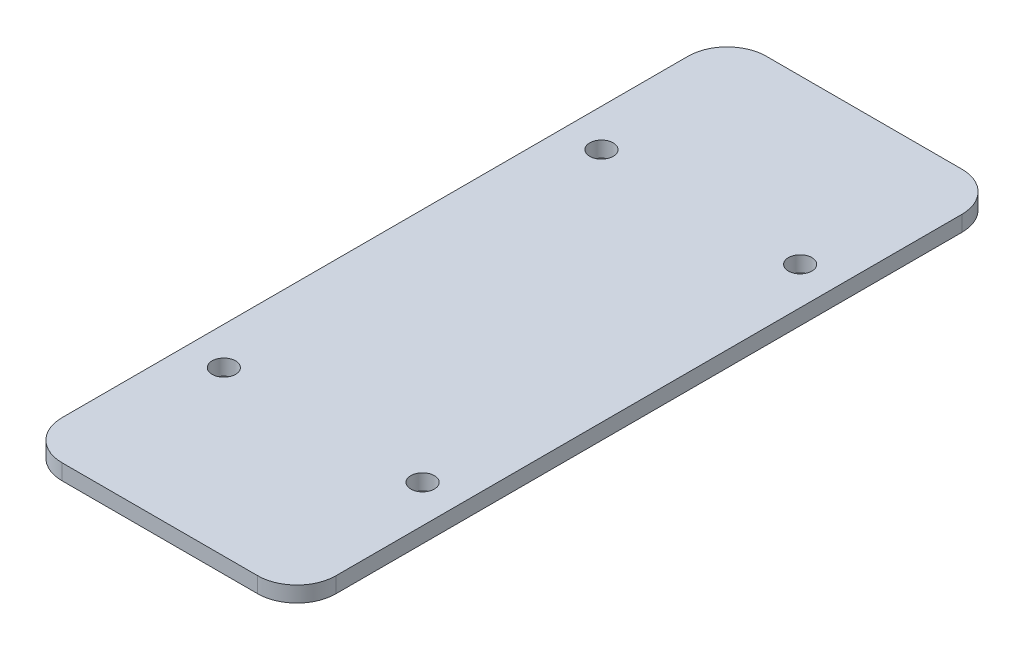
ISO-10303-21;
HEADER;
FILE_DESCRIPTION(('STEP AP214'),'2;1');
FILE_NAME('part.step','',(''),(''),'','','');
FILE_SCHEMA(('AUTOMOTIVE_DESIGN { 1 0 10303 214 1 1 1 1 }'));
ENDSEC;
DATA;
#1=APPLICATION_CONTEXT('core data for automotive mechanical design processes');
#2=APPLICATION_PROTOCOL_DEFINITION('international standard','automotive_design',2000,#1);
#3=PRODUCT_CONTEXT('',#1,'mechanical');
#4=PRODUCT('Part','Part','',(#3));
#5=PRODUCT_RELATED_PRODUCT_CATEGORY('part','',(#4));
#6=PRODUCT_DEFINITION_FORMATION('','',#4);
#7=PRODUCT_DEFINITION_CONTEXT('part definition',#1,'design');
#8=PRODUCT_DEFINITION('design','',#6,#7);
#9=PRODUCT_DEFINITION_SHAPE('','',#8);
#10=(LENGTH_UNIT() NAMED_UNIT(*) SI_UNIT(.MILLI.,.METRE.));
#11=(NAMED_UNIT(*) PLANE_ANGLE_UNIT() SI_UNIT($,.RADIAN.));
#12=(NAMED_UNIT(*) SI_UNIT($,.STERADIAN.) SOLID_ANGLE_UNIT());
#13=UNCERTAINTY_MEASURE_WITH_UNIT(LENGTH_MEASURE(1.E-05),#10,'distance_accuracy_value','');
#14=(GEOMETRIC_REPRESENTATION_CONTEXT(3) GLOBAL_UNCERTAINTY_ASSIGNED_CONTEXT((#13)) GLOBAL_UNIT_ASSIGNED_CONTEXT((#10,
#11,#12)) REPRESENTATION_CONTEXT('',''));
#15=CARTESIAN_POINT('',(0.,0.,0.));
#16=DIRECTION('',(0.,0.,1.));
#17=DIRECTION('',(1.,0.,0.));
#18=AXIS2_PLACEMENT_3D('',#15,#16,#17);
#19=CARTESIAN_POINT('',(17.5,2.,45.));
#20=DIRECTION('',(-1.,0.,0.));
#21=DIRECTION('',(0.,0.,1.));
#22=AXIS2_PLACEMENT_3D('',#19,#20,#21);
#23=PLANE('',#22);
#24=DIRECTION('',(0.,0.,-1.));
#25=VECTOR('',#24,1.);
#26=CARTESIAN_POINT('',(17.5,2.,45.));
#27=LINE('',#26,#25);
#28=CARTESIAN_POINT('',(17.5,2.,40.));
#29=VERTEX_POINT('',#28);
#30=CARTESIAN_POINT('',(17.5,2.,-40.));
#31=VERTEX_POINT('',#30);
#32=EDGE_CURVE('E133',#29,#31,#27,.T.);
#33=ORIENTED_EDGE('',*,*,#32,.F.);
#34=DIRECTION('',(0.,-1.,0.));
#35=VECTOR('',#34,1.);
#36=CARTESIAN_POINT('',(17.5,2.,40.));
#37=LINE('',#36,#35);
#38=CARTESIAN_POINT('',(17.5,0.,40.));
#39=VERTEX_POINT('',#38);
#40=EDGE_CURVE('E159',#29,#39,#37,.T.);
#41=ORIENTED_EDGE('',*,*,#40,.T.);
#42=DIRECTION('',(0.,0.,-1.));
#43=VECTOR('',#42,1.);
#44=CARTESIAN_POINT('',(17.5,0.,45.));
#45=LINE('',#44,#43);
#46=CARTESIAN_POINT('',(17.5,0.,-40.));
#47=VERTEX_POINT('',#46);
#48=EDGE_CURVE('E165',#39,#47,#45,.T.);
#49=ORIENTED_EDGE('',*,*,#48,.T.);
#50=DIRECTION('',(0.,-1.,0.));
#51=VECTOR('',#50,1.);
#52=CARTESIAN_POINT('',(17.5,2.,-40.));
#53=LINE('',#52,#51);
#54=EDGE_CURVE('E157',#47,#31,#53,.F.);
#55=ORIENTED_EDGE('',*,*,#54,.T.);
#56=EDGE_LOOP('',(#33,#41,#49,#55));
#57=FACE_BOUND('',#56,.T.);
#58=ADVANCED_FACE('F41',(#57),#23,.F.);
#59=CARTESIAN_POINT('',(-17.5,2.,-45.));
#60=DIRECTION('',(0.,0.,1.));
#61=DIRECTION('',(1.,0.,0.));
#62=AXIS2_PLACEMENT_3D('',#59,#60,#61);
#63=PLANE('',#62);
#64=DIRECTION('',(-1.,0.,0.));
#65=VECTOR('',#64,1.);
#66=CARTESIAN_POINT('',(-17.5,2.,-45.));
#67=LINE('',#66,#65);
#68=CARTESIAN_POINT('',(12.5,2.,-45.));
#69=VERTEX_POINT('',#68);
#70=CARTESIAN_POINT('',(-12.5,2.,-45.));
#71=VERTEX_POINT('',#70);
#72=EDGE_CURVE('E136',#69,#71,#67,.T.);
#73=ORIENTED_EDGE('',*,*,#72,.F.);
#74=DIRECTION('',(0.,-1.,0.));
#75=VECTOR('',#74,1.);
#76=CARTESIAN_POINT('',(12.5,2.,-45.));
#77=LINE('',#76,#75);
#78=CARTESIAN_POINT('',(12.5,0.,-45.));
#79=VERTEX_POINT('',#78);
#80=EDGE_CURVE('E11',#69,#79,#77,.T.);
#81=ORIENTED_EDGE('',*,*,#80,.T.);
#82=DIRECTION('',(-1.,0.,0.));
#83=VECTOR('',#82,1.);
#84=CARTESIAN_POINT('',(-17.5,0.,-45.));
#85=LINE('',#84,#83);
#86=CARTESIAN_POINT('',(-12.5,0.,-45.));
#87=VERTEX_POINT('',#86);
#88=EDGE_CURVE('E138',#79,#87,#85,.T.);
#89=ORIENTED_EDGE('',*,*,#88,.T.);
#90=DIRECTION('',(0.,-1.,0.));
#91=VECTOR('',#90,1.);
#92=CARTESIAN_POINT('',(-12.5,2.,-45.));
#93=LINE('',#92,#91);
#94=EDGE_CURVE('E49',#87,#71,#93,.F.);
#95=ORIENTED_EDGE('',*,*,#94,.T.);
#96=EDGE_LOOP('',(#73,#81,#89,#95));
#97=FACE_BOUND('',#96,.T.);
#98=ADVANCED_FACE('F216',(#97),#63,.F.);
#99=CARTESIAN_POINT('',(-17.5,2.,45.));
#100=DIRECTION('',(1.,0.,0.));
#101=DIRECTION('',(0.,0.,-1.));
#102=AXIS2_PLACEMENT_3D('',#99,#100,#101);
#103=PLANE('',#102);
#104=DIRECTION('',(0.,0.,1.));
#105=VECTOR('',#104,1.);
#106=CARTESIAN_POINT('',(-17.5,0.,45.));
#107=LINE('',#106,#105);
#108=CARTESIAN_POINT('',(-17.5,0.,-40.));
#109=VERTEX_POINT('',#108);
#110=CARTESIAN_POINT('',(-17.5,0.,40.));
#111=VERTEX_POINT('',#110);
#112=EDGE_CURVE('E134',#109,#111,#107,.T.);
#113=ORIENTED_EDGE('',*,*,#112,.T.);
#114=DIRECTION('',(0.,-1.,0.));
#115=VECTOR('',#114,1.);
#116=CARTESIAN_POINT('',(-17.5,2.,40.));
#117=LINE('',#116,#115);
#118=CARTESIAN_POINT('',(-17.5,2.,40.));
#119=VERTEX_POINT('',#118);
#120=EDGE_CURVE('E112',#111,#119,#117,.F.);
#121=ORIENTED_EDGE('',*,*,#120,.T.);
#122=DIRECTION('',(0.,0.,1.));
#123=VECTOR('',#122,1.);
#124=CARTESIAN_POINT('',(-17.5,2.,45.));
#125=LINE('',#124,#123);
#126=CARTESIAN_POINT('',(-17.5,2.,-40.));
#127=VERTEX_POINT('',#126);
#128=EDGE_CURVE('E177',#127,#119,#125,.T.);
#129=ORIENTED_EDGE('',*,*,#128,.F.);
#130=DIRECTION('',(0.,-1.,0.));
#131=VECTOR('',#130,1.);
#132=CARTESIAN_POINT('',(-17.5,2.,-40.));
#133=LINE('',#132,#131);
#134=EDGE_CURVE('E117',#127,#109,#133,.T.);
#135=ORIENTED_EDGE('',*,*,#134,.T.);
#136=EDGE_LOOP('',(#113,#121,#129,#135));
#137=FACE_BOUND('',#136,.T.);
#138=ADVANCED_FACE('F214',(#137),#103,.F.);
#139=CARTESIAN_POINT('',(-17.5,2.,45.));
#140=DIRECTION('',(0.,0.,-1.));
#141=DIRECTION('',(-1.,0.,0.));
#142=AXIS2_PLACEMENT_3D('',#139,#140,#141);
#143=PLANE('',#142);
#144=DIRECTION('',(1.,0.,0.));
#145=VECTOR('',#144,1.);
#146=CARTESIAN_POINT('',(-17.5,2.,45.));
#147=LINE('',#146,#145);
#148=CARTESIAN_POINT('',(-12.5,2.,45.));
#149=VERTEX_POINT('',#148);
#150=CARTESIAN_POINT('',(12.5,2.,45.));
#151=VERTEX_POINT('',#150);
#152=EDGE_CURVE('E127',#149,#151,#147,.T.);
#153=ORIENTED_EDGE('',*,*,#152,.F.);
#154=DIRECTION('',(0.,-1.,0.));
#155=VECTOR('',#154,1.);
#156=CARTESIAN_POINT('',(-12.5,2.,45.));
#157=LINE('',#156,#155);
#158=CARTESIAN_POINT('',(-12.5,0.,45.));
#159=VERTEX_POINT('',#158);
#160=EDGE_CURVE('E111',#149,#159,#157,.T.);
#161=ORIENTED_EDGE('',*,*,#160,.T.);
#162=DIRECTION('',(1.,0.,0.));
#163=VECTOR('',#162,1.);
#164=CARTESIAN_POINT('',(-17.5,0.,45.));
#165=LINE('',#164,#163);
#166=CARTESIAN_POINT('',(12.5,0.,45.));
#167=VERTEX_POINT('',#166);
#168=EDGE_CURVE('E124',#159,#167,#165,.T.);
#169=ORIENTED_EDGE('',*,*,#168,.T.);
#170=DIRECTION('',(0.,-1.,0.));
#171=VECTOR('',#170,1.);
#172=CARTESIAN_POINT('',(12.5,2.,45.));
#173=LINE('',#172,#171);
#174=EDGE_CURVE('E129',#167,#151,#173,.F.);
#175=ORIENTED_EDGE('',*,*,#174,.T.);
#176=EDGE_LOOP('',(#153,#161,#169,#175));
#177=FACE_BOUND('',#176,.T.);
#178=ADVANCED_FACE('F123',(#177),#143,.F.);
#179=CARTESIAN_POINT('',(0.,2.,0.));
#180=DIRECTION('',(0.,-1.,0.));
#181=DIRECTION('',(0.,0.,-1.));
#182=AXIS2_PLACEMENT_3D('',#179,#180,#181);
#183=PLANE('',#182);
#184=CARTESIAN_POINT('',(-12.7,2.,24.13));
#185=DIRECTION('',(0.,1.,0.));
#186=DIRECTION('',(0.,0.,1.));
#187=AXIS2_PLACEMENT_3D('',#184,#185,#186);
#188=CIRCLE('',#187,1.5);
#189=CARTESIAN_POINT('',(-12.7,2.,25.63));
#190=VERTEX_POINT('',#189);
#191=EDGE_CURVE('E187',#190,#190,#188,.T.);
#192=ORIENTED_EDGE('',*,*,#191,.F.);
#193=EDGE_LOOP('',(#192));
#194=FACE_BOUND('',#193,.T.);
#195=CARTESIAN_POINT('',(12.7,2.,24.13));
#196=DIRECTION('',(0.,1.,0.));
#197=DIRECTION('',(0.,0.,1.));
#198=AXIS2_PLACEMENT_3D('',#195,#196,#197);
#199=CIRCLE('',#198,1.5);
#200=CARTESIAN_POINT('',(12.7,2.,25.63));
#201=VERTEX_POINT('',#200);
#202=EDGE_CURVE('E193',#201,#201,#199,.T.);
#203=ORIENTED_EDGE('',*,*,#202,.F.);
#204=EDGE_LOOP('',(#203));
#205=FACE_BOUND('',#204,.T.);
#206=CARTESIAN_POINT('',(12.7,2.,-24.13));
#207=DIRECTION('',(0.,1.,0.));
#208=DIRECTION('',(0.,0.,1.));
#209=AXIS2_PLACEMENT_3D('',#206,#207,#208);
#210=CIRCLE('',#209,1.5);
#211=CARTESIAN_POINT('',(12.7,2.,-22.63));
#212=VERTEX_POINT('',#211);
#213=EDGE_CURVE('E182',#212,#212,#210,.T.);
#214=ORIENTED_EDGE('',*,*,#213,.F.);
#215=EDGE_LOOP('',(#214));
#216=FACE_BOUND('',#215,.T.);
#217=CARTESIAN_POINT('',(-12.7,2.,-24.13));
#218=DIRECTION('',(0.,1.,0.));
#219=DIRECTION('',(0.,0.,1.));
#220=AXIS2_PLACEMENT_3D('',#217,#218,#219);
#221=CIRCLE('',#220,1.5);
#222=CARTESIAN_POINT('',(-12.7,2.,-22.63));
#223=VERTEX_POINT('',#222);
#224=EDGE_CURVE('E173',#223,#223,#221,.T.);
#225=ORIENTED_EDGE('',*,*,#224,.F.);
#226=EDGE_LOOP('',(#225));
#227=FACE_BOUND('',#226,.T.);
#228=ORIENTED_EDGE('',*,*,#128,.T.);
#229=CARTESIAN_POINT('',(-12.5,2.,40.));
#230=DIRECTION('',(0.,-1.,0.));
#231=DIRECTION('',(0.,0.,-1.));
#232=AXIS2_PLACEMENT_3D('',#229,#230,#231);
#233=CIRCLE('',#232,5.);
#234=EDGE_CURVE('E155',#119,#149,#233,.F.);
#235=ORIENTED_EDGE('',*,*,#234,.T.);
#236=ORIENTED_EDGE('',*,*,#152,.T.);
#237=CARTESIAN_POINT('',(12.5,2.,40.));
#238=DIRECTION('',(0.,-1.,0.));
#239=DIRECTION('',(0.,0.,-1.));
#240=AXIS2_PLACEMENT_3D('',#237,#238,#239);
#241=CIRCLE('',#240,5.);
#242=EDGE_CURVE('E153',#151,#29,#241,.F.);
#243=ORIENTED_EDGE('',*,*,#242,.T.);
#244=ORIENTED_EDGE('',*,*,#32,.T.);
#245=CARTESIAN_POINT('',(12.5,2.,-40.));
#246=DIRECTION('',(0.,-1.,0.));
#247=DIRECTION('',(0.,0.,-1.));
#248=AXIS2_PLACEMENT_3D('',#245,#246,#247);
#249=CIRCLE('',#248,5.);
#250=EDGE_CURVE('E62',#31,#69,#249,.F.);
#251=ORIENTED_EDGE('',*,*,#250,.T.);
#252=ORIENTED_EDGE('',*,*,#72,.T.);
#253=CARTESIAN_POINT('',(-12.5,2.,-40.));
#254=DIRECTION('',(0.,-1.,0.));
#255=DIRECTION('',(0.,0.,-1.));
#256=AXIS2_PLACEMENT_3D('',#253,#254,#255);
#257=CIRCLE('',#256,5.);
#258=EDGE_CURVE('E150',#71,#127,#257,.F.);
#259=ORIENTED_EDGE('',*,*,#258,.T.);
#260=EDGE_LOOP('',(#228,#235,#236,#243,#244,#251,#252,#259));
#261=FACE_BOUND('',#260,.T.);
#262=ADVANCED_FACE('F204',(#194,#205,#216,#227,#261),#183,.F.);
#263=CARTESIAN_POINT('',(0.,0.,0.));
#264=DIRECTION('',(0.,-1.,0.));
#265=DIRECTION('',(0.,0.,-1.));
#266=AXIS2_PLACEMENT_3D('',#263,#264,#265);
#267=PLANE('',#266);
#268=CARTESIAN_POINT('',(-12.7,0.,24.13));
#269=DIRECTION('',(0.,1.,0.));
#270=DIRECTION('',(0.,0.,1.));
#271=AXIS2_PLACEMENT_3D('',#268,#269,#270);
#272=CIRCLE('',#271,1.5);
#273=CARTESIAN_POINT('',(-12.7,0.,25.63));
#274=VERTEX_POINT('',#273);
#275=EDGE_CURVE('E184',#274,#274,#272,.T.);
#276=ORIENTED_EDGE('',*,*,#275,.T.);
#277=EDGE_LOOP('',(#276));
#278=FACE_BOUND('',#277,.T.);
#279=CARTESIAN_POINT('',(12.7,0.,24.13));
#280=DIRECTION('',(0.,1.,0.));
#281=DIRECTION('',(0.,0.,1.));
#282=AXIS2_PLACEMENT_3D('',#279,#280,#281);
#283=CIRCLE('',#282,1.5);
#284=CARTESIAN_POINT('',(12.7,0.,25.63));
#285=VERTEX_POINT('',#284);
#286=EDGE_CURVE('E190',#285,#285,#283,.T.);
#287=ORIENTED_EDGE('',*,*,#286,.T.);
#288=EDGE_LOOP('',(#287));
#289=FACE_BOUND('',#288,.T.);
#290=CARTESIAN_POINT('',(12.7,0.,-24.13));
#291=DIRECTION('',(0.,1.,0.));
#292=DIRECTION('',(0.,0.,1.));
#293=AXIS2_PLACEMENT_3D('',#290,#291,#292);
#294=CIRCLE('',#293,1.5);
#295=CARTESIAN_POINT('',(12.7,0.,-22.63));
#296=VERTEX_POINT('',#295);
#297=EDGE_CURVE('E196',#296,#296,#294,.T.);
#298=ORIENTED_EDGE('',*,*,#297,.T.);
#299=EDGE_LOOP('',(#298));
#300=FACE_BOUND('',#299,.T.);
#301=CARTESIAN_POINT('',(-12.7,0.,-24.13));
#302=DIRECTION('',(0.,1.,0.));
#303=DIRECTION('',(0.,0.,1.));
#304=AXIS2_PLACEMENT_3D('',#301,#302,#303);
#305=CIRCLE('',#304,1.5);
#306=CARTESIAN_POINT('',(-12.7,0.,-22.63));
#307=VERTEX_POINT('',#306);
#308=EDGE_CURVE('E170',#307,#307,#305,.T.);
#309=ORIENTED_EDGE('',*,*,#308,.T.);
#310=EDGE_LOOP('',(#309));
#311=FACE_BOUND('',#310,.T.);
#312=ORIENTED_EDGE('',*,*,#168,.F.);
#313=CARTESIAN_POINT('',(-12.5,0.,40.));
#314=DIRECTION('',(0.,-1.,0.));
#315=DIRECTION('',(0.,0.,-1.));
#316=AXIS2_PLACEMENT_3D('',#313,#314,#315);
#317=CIRCLE('',#316,5.);
#318=EDGE_CURVE('E107',#159,#111,#317,.T.);
#319=ORIENTED_EDGE('',*,*,#318,.T.);
#320=ORIENTED_EDGE('',*,*,#112,.F.);
#321=CARTESIAN_POINT('',(-12.5,0.,-40.));
#322=DIRECTION('',(0.,-1.,0.));
#323=DIRECTION('',(0.,0.,-1.));
#324=AXIS2_PLACEMENT_3D('',#321,#322,#323);
#325=CIRCLE('',#324,5.);
#326=EDGE_CURVE('E128',#109,#87,#325,.T.);
#327=ORIENTED_EDGE('',*,*,#326,.T.);
#328=ORIENTED_EDGE('',*,*,#88,.F.);
#329=CARTESIAN_POINT('',(12.5,0.,-40.));
#330=DIRECTION('',(0.,-1.,0.));
#331=DIRECTION('',(0.,0.,-1.));
#332=AXIS2_PLACEMENT_3D('',#329,#330,#331);
#333=CIRCLE('',#332,5.);
#334=EDGE_CURVE('E144',#79,#47,#333,.T.);
#335=ORIENTED_EDGE('',*,*,#334,.T.);
#336=ORIENTED_EDGE('',*,*,#48,.F.);
#337=CARTESIAN_POINT('',(12.5,0.,40.));
#338=DIRECTION('',(0.,-1.,0.));
#339=DIRECTION('',(0.,0.,-1.));
#340=AXIS2_PLACEMENT_3D('',#337,#338,#339);
#341=CIRCLE('',#340,5.);
#342=EDGE_CURVE('E118',#39,#167,#341,.T.);
#343=ORIENTED_EDGE('',*,*,#342,.T.);
#344=EDGE_LOOP('',(#312,#319,#320,#327,#328,#335,#336,#343));
#345=FACE_BOUND('',#344,.T.);
#346=ADVANCED_FACE('F131',(#278,#289,#300,#311,#345),#267,.T.);
#347=CARTESIAN_POINT('',(-12.7,0.,-24.13));
#348=DIRECTION('',(0.,1.,0.));
#349=DIRECTION('',(0.,0.,1.));
#350=AXIS2_PLACEMENT_3D('',#347,#348,#349);
#351=CYLINDRICAL_SURFACE('',#350,1.5);
#352=ORIENTED_EDGE('',*,*,#308,.F.);
#353=EDGE_LOOP('',(#352));
#354=FACE_BOUND('',#353,.T.);
#355=ORIENTED_EDGE('',*,*,#224,.T.);
#356=EDGE_LOOP('',(#355));
#357=FACE_BOUND('',#356,.T.);
#358=ADVANCED_FACE('F242',(#354,#357),#351,.F.);
#359=CARTESIAN_POINT('',(12.7,0.,-24.13));
#360=DIRECTION('',(0.,1.,0.));
#361=DIRECTION('',(0.,0.,1.));
#362=AXIS2_PLACEMENT_3D('',#359,#360,#361);
#363=CYLINDRICAL_SURFACE('',#362,1.5);
#364=ORIENTED_EDGE('',*,*,#297,.F.);
#365=EDGE_LOOP('',(#364));
#366=FACE_BOUND('',#365,.T.);
#367=ORIENTED_EDGE('',*,*,#213,.T.);
#368=EDGE_LOOP('',(#367));
#369=FACE_BOUND('',#368,.T.);
#370=ADVANCED_FACE('F202',(#366,#369),#363,.F.);
#371=CARTESIAN_POINT('',(12.7,0.,24.13));
#372=DIRECTION('',(0.,1.,0.));
#373=DIRECTION('',(0.,0.,1.));
#374=AXIS2_PLACEMENT_3D('',#371,#372,#373);
#375=CYLINDRICAL_SURFACE('',#374,1.5);
#376=ORIENTED_EDGE('',*,*,#286,.F.);
#377=EDGE_LOOP('',(#376));
#378=FACE_BOUND('',#377,.T.);
#379=ORIENTED_EDGE('',*,*,#202,.T.);
#380=EDGE_LOOP('',(#379));
#381=FACE_BOUND('',#380,.T.);
#382=ADVANCED_FACE('F249',(#378,#381),#375,.F.);
#383=CARTESIAN_POINT('',(-12.7,0.,24.13));
#384=DIRECTION('',(0.,1.,0.));
#385=DIRECTION('',(0.,0.,1.));
#386=AXIS2_PLACEMENT_3D('',#383,#384,#385);
#387=CYLINDRICAL_SURFACE('',#386,1.5);
#388=ORIENTED_EDGE('',*,*,#275,.F.);
#389=EDGE_LOOP('',(#388));
#390=FACE_BOUND('',#389,.T.);
#391=ORIENTED_EDGE('',*,*,#191,.T.);
#392=EDGE_LOOP('',(#391));
#393=FACE_BOUND('',#392,.T.);
#394=ADVANCED_FACE('F227',(#390,#393),#387,.F.);
#395=CARTESIAN_POINT('',(-12.5,2.,40.));
#396=DIRECTION('',(0.,-1.,0.));
#397=DIRECTION('',(0.,0.,-1.));
#398=AXIS2_PLACEMENT_3D('',#395,#396,#397);
#399=CYLINDRICAL_SURFACE('',#398,5.);
#400=ORIENTED_EDGE('',*,*,#234,.F.);
#401=ORIENTED_EDGE('',*,*,#120,.F.);
#402=ORIENTED_EDGE('',*,*,#318,.F.);
#403=ORIENTED_EDGE('',*,*,#160,.F.);
#404=EDGE_LOOP('',(#400,#401,#402,#403));
#405=FACE_BOUND('',#404,.T.);
#406=ADVANCED_FACE('F110',(#405),#399,.T.);
#407=CARTESIAN_POINT('',(12.5,2.,40.));
#408=DIRECTION('',(0.,-1.,0.));
#409=DIRECTION('',(0.,0.,-1.));
#410=AXIS2_PLACEMENT_3D('',#407,#408,#409);
#411=CYLINDRICAL_SURFACE('',#410,5.);
#412=ORIENTED_EDGE('',*,*,#242,.F.);
#413=ORIENTED_EDGE('',*,*,#174,.F.);
#414=ORIENTED_EDGE('',*,*,#342,.F.);
#415=ORIENTED_EDGE('',*,*,#40,.F.);
#416=EDGE_LOOP('',(#412,#413,#414,#415));
#417=FACE_BOUND('',#416,.T.);
#418=ADVANCED_FACE('F220',(#417),#411,.T.);
#419=CARTESIAN_POINT('',(12.5,2.,-40.));
#420=DIRECTION('',(0.,-1.,0.));
#421=DIRECTION('',(0.,0.,-1.));
#422=AXIS2_PLACEMENT_3D('',#419,#420,#421);
#423=CYLINDRICAL_SURFACE('',#422,5.);
#424=ORIENTED_EDGE('',*,*,#250,.F.);
#425=ORIENTED_EDGE('',*,*,#54,.F.);
#426=ORIENTED_EDGE('',*,*,#334,.F.);
#427=ORIENTED_EDGE('',*,*,#80,.F.);
#428=EDGE_LOOP('',(#424,#425,#426,#427));
#429=FACE_BOUND('',#428,.T.);
#430=ADVANCED_FACE('F219',(#429),#423,.T.);
#431=CARTESIAN_POINT('',(-12.5,2.,-40.));
#432=DIRECTION('',(0.,-1.,0.));
#433=DIRECTION('',(0.,0.,-1.));
#434=AXIS2_PLACEMENT_3D('',#431,#432,#433);
#435=CYLINDRICAL_SURFACE('',#434,5.);
#436=ORIENTED_EDGE('',*,*,#258,.F.);
#437=ORIENTED_EDGE('',*,*,#94,.F.);
#438=ORIENTED_EDGE('',*,*,#326,.F.);
#439=ORIENTED_EDGE('',*,*,#134,.F.);
#440=EDGE_LOOP('',(#436,#437,#438,#439));
#441=FACE_BOUND('',#440,.T.);
#442=ADVANCED_FACE('F43',(#441),#435,.T.);
#443=CLOSED_SHELL('',(#58,#98,#138,#178,#262,#346,#358,#370,#382,#394,#406,#418,#430,#442));
#444=MANIFOLD_SOLID_BREP('B2',#443);
#445=ADVANCED_BREP_SHAPE_REPRESENTATION('',(#18,#444),#14);
#446=SHAPE_DEFINITION_REPRESENTATION(#9,#445);
ENDSEC;
END-ISO-10303-21;
